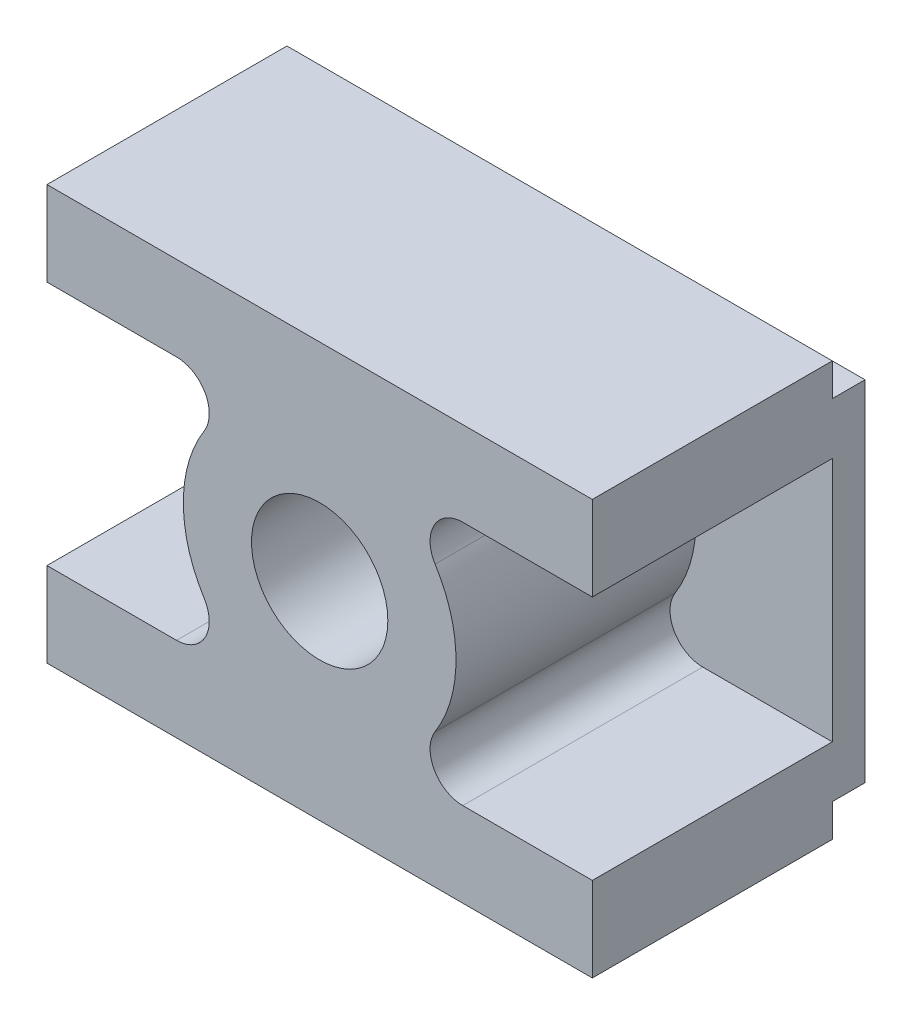
ISO-10303-21;
HEADER;
FILE_DESCRIPTION(('STEP AP214'),'2;1');
FILE_NAME('part.step','',(''),(''),'','','');
FILE_SCHEMA(('AUTOMOTIVE_DESIGN { 1 0 10303 214 1 1 1 1 }'));
ENDSEC;
DATA;
#1=APPLICATION_CONTEXT('core data for automotive mechanical design processes');
#2=APPLICATION_PROTOCOL_DEFINITION('international standard','automotive_design',2000,#1);
#3=PRODUCT_CONTEXT('',#1,'mechanical');
#4=PRODUCT('Part','Part','',(#3));
#5=PRODUCT_RELATED_PRODUCT_CATEGORY('part','',(#4));
#6=PRODUCT_DEFINITION_FORMATION('','',#4);
#7=PRODUCT_DEFINITION_CONTEXT('part definition',#1,'design');
#8=PRODUCT_DEFINITION('design','',#6,#7);
#9=PRODUCT_DEFINITION_SHAPE('','',#8);
#10=(LENGTH_UNIT() NAMED_UNIT(*) SI_UNIT(.MILLI.,.METRE.));
#11=(NAMED_UNIT(*) PLANE_ANGLE_UNIT() SI_UNIT($,.RADIAN.));
#12=(NAMED_UNIT(*) SI_UNIT($,.STERADIAN.) SOLID_ANGLE_UNIT());
#13=UNCERTAINTY_MEASURE_WITH_UNIT(LENGTH_MEASURE(1.E-05),#10,'distance_accuracy_value','');
#14=(GEOMETRIC_REPRESENTATION_CONTEXT(3) GLOBAL_UNCERTAINTY_ASSIGNED_CONTEXT((#13)) GLOBAL_UNIT_ASSIGNED_CONTEXT((#10,
#11,#12)) REPRESENTATION_CONTEXT('',''));
#15=CARTESIAN_POINT('',(0.,0.,0.));
#16=DIRECTION('',(0.,0.,1.));
#17=DIRECTION('',(1.,0.,0.));
#18=AXIS2_PLACEMENT_3D('',#15,#16,#17);
#19=CARTESIAN_POINT('',(26.2440469440214,16.5,50.));
#20=DIRECTION('',(0.,0.,-1.));
#21=DIRECTION('',(-1.,0.,0.));
#22=AXIS2_PLACEMENT_3D('',#19,#20,#21);
#23=CYLINDRICAL_SURFACE('',#22,5.99999999999999);
#24=DIRECTION('',(0.,0.,-1.));
#25=VECTOR('',#24,1.);
#26=CARTESIAN_POINT('',(21.1645539871141,13.3064516129032,50.));
#27=LINE('',#26,#25);
#28=CARTESIAN_POINT('',(21.1645539871141,13.3064516129032,50.));
#29=VERTEX_POINT('',#28);
#30=CARTESIAN_POINT('',(21.1645539871141,13.3064516129032,6.));
#31=VERTEX_POINT('',#30);
#32=EDGE_CURVE('E280',#29,#31,#27,.T.);
#33=ORIENTED_EDGE('',*,*,#32,.T.);
#34=CARTESIAN_POINT('',(26.2440469440214,16.5,6.));
#35=DIRECTION('',(0.,0.,-1.));
#36=DIRECTION('',(-1.,0.,0.));
#37=AXIS2_PLACEMENT_3D('',#34,#35,#36);
#38=CIRCLE('',#37,6.);
#39=CARTESIAN_POINT('',(26.2440469440214,22.5,6.));
#40=VERTEX_POINT('',#39);
#41=EDGE_CURVE('E226',#31,#40,#38,.T.);
#42=ORIENTED_EDGE('',*,*,#41,.T.);
#43=DIRECTION('',(0.,0.,-1.));
#44=VECTOR('',#43,1.);
#45=CARTESIAN_POINT('',(26.2440469440214,22.5,50.));
#46=LINE('',#45,#44);
#47=CARTESIAN_POINT('',(26.2440469440214,22.5,50.));
#48=VERTEX_POINT('',#47);
#49=EDGE_CURVE('E11',#48,#40,#46,.T.);
#50=ORIENTED_EDGE('',*,*,#49,.F.);
#51=CARTESIAN_POINT('',(26.2440469440214,16.5,50.));
#52=DIRECTION('',(0.,0.,1.));
#53=DIRECTION('',(1.,0.,0.));
#54=AXIS2_PLACEMENT_3D('',#51,#52,#53);
#55=CIRCLE('',#54,5.99999999999999);
#56=EDGE_CURVE('E243',#48,#29,#55,.T.);
#57=ORIENTED_EDGE('',*,*,#56,.T.);
#58=EDGE_LOOP('',(#33,#42,#50,#57));
#59=FACE_BOUND('',#58,.T.);
#60=ADVANCED_FACE('F35',(#59),#23,.F.);
#61=CARTESIAN_POINT('',(0.,22.5,50.));
#62=DIRECTION('',(0.,1.,0.));
#63=DIRECTION('',(0.,0.,1.));
#64=AXIS2_PLACEMENT_3D('',#61,#62,#63);
#65=PLANE('',#64);
#66=DIRECTION('',(1.,0.,0.));
#67=VECTOR('',#66,1.);
#68=CARTESIAN_POINT('',(26.2440469440214,22.5,6.));
#69=LINE('',#68,#67);
#70=CARTESIAN_POINT('',(50.,22.5,6.));
#71=VERTEX_POINT('',#70);
#72=EDGE_CURVE('E221',#40,#71,#69,.T.);
#73=ORIENTED_EDGE('',*,*,#72,.T.);
#74=DIRECTION('',(0.,0.,-1.));
#75=VECTOR('',#74,1.);
#76=CARTESIAN_POINT('',(50.,22.5,50.));
#77=LINE('',#76,#75);
#78=CARTESIAN_POINT('',(50.,22.5,50.));
#79=VERTEX_POINT('',#78);
#80=EDGE_CURVE('E42',#79,#71,#77,.T.);
#81=ORIENTED_EDGE('',*,*,#80,.F.);
#82=DIRECTION('',(1.,0.,0.));
#83=VECTOR('',#82,1.);
#84=CARTESIAN_POINT('',(0.,22.5,50.));
#85=LINE('',#84,#83);
#86=EDGE_CURVE('E246',#48,#79,#85,.T.);
#87=ORIENTED_EDGE('',*,*,#86,.F.);
#88=ORIENTED_EDGE('',*,*,#49,.T.);
#89=EDGE_LOOP('',(#73,#81,#87,#88));
#90=FACE_BOUND('',#89,.T.);
#91=ADVANCED_FACE('F357',(#90),#65,.F.);
#92=CARTESIAN_POINT('',(0.,-22.5,50.));
#93=DIRECTION('',(0.,1.,0.));
#94=DIRECTION('',(0.,0.,1.));
#95=AXIS2_PLACEMENT_3D('',#92,#93,#94);
#96=PLANE('',#95);
#97=DIRECTION('',(0.,0.,-1.));
#98=VECTOR('',#97,1.);
#99=CARTESIAN_POINT('',(50.,-22.5,50.));
#100=LINE('',#99,#98);
#101=CARTESIAN_POINT('',(50.,-22.5,50.));
#102=VERTEX_POINT('',#101);
#103=CARTESIAN_POINT('',(50.,-22.5,6.));
#104=VERTEX_POINT('',#103);
#105=EDGE_CURVE('E295',#102,#104,#100,.T.);
#106=ORIENTED_EDGE('',*,*,#105,.T.);
#107=DIRECTION('',(-1.,0.,0.));
#108=VECTOR('',#107,1.);
#109=CARTESIAN_POINT('',(26.2440469440214,-22.5,6.));
#110=LINE('',#109,#108);
#111=CARTESIAN_POINT('',(26.2440469440214,-22.5,6.));
#112=VERTEX_POINT('',#111);
#113=EDGE_CURVE('E222',#104,#112,#110,.T.);
#114=ORIENTED_EDGE('',*,*,#113,.T.);
#115=DIRECTION('',(0.,0.,-1.));
#116=VECTOR('',#115,1.);
#117=CARTESIAN_POINT('',(26.2440469440214,-22.5,50.));
#118=LINE('',#117,#116);
#119=CARTESIAN_POINT('',(26.2440469440214,-22.5,50.));
#120=VERTEX_POINT('',#119);
#121=EDGE_CURVE('E292',#120,#112,#118,.T.);
#122=ORIENTED_EDGE('',*,*,#121,.F.);
#123=DIRECTION('',(1.,0.,0.));
#124=VECTOR('',#123,1.);
#125=CARTESIAN_POINT('',(0.,-22.5,50.));
#126=LINE('',#125,#124);
#127=EDGE_CURVE('E269',#120,#102,#126,.T.);
#128=ORIENTED_EDGE('',*,*,#127,.T.);
#129=EDGE_LOOP('',(#106,#114,#122,#128));
#130=FACE_BOUND('',#129,.T.);
#131=ADVANCED_FACE('F362',(#130),#96,.T.);
#132=CARTESIAN_POINT('',(26.2440469440214,-16.5,50.));
#133=DIRECTION('',(0.,0.,-1.));
#134=DIRECTION('',(-1.,0.,0.));
#135=AXIS2_PLACEMENT_3D('',#132,#133,#134);
#136=CYLINDRICAL_SURFACE('',#135,6.);
#137=ORIENTED_EDGE('',*,*,#121,.T.);
#138=CARTESIAN_POINT('',(26.2440469440214,-16.5,6.));
#139=DIRECTION('',(0.,0.,-1.));
#140=DIRECTION('',(-1.,0.,0.));
#141=AXIS2_PLACEMENT_3D('',#138,#139,#140);
#142=CIRCLE('',#141,6.);
#143=CARTESIAN_POINT('',(21.1645539871141,-13.3064516129032,6.));
#144=VERTEX_POINT('',#143);
#145=EDGE_CURVE('E368',#112,#144,#142,.T.);
#146=ORIENTED_EDGE('',*,*,#145,.T.);
#147=DIRECTION('',(0.,0.,-1.));
#148=VECTOR('',#147,1.);
#149=CARTESIAN_POINT('',(21.1645539871141,-13.3064516129032,50.));
#150=LINE('',#149,#148);
#151=CARTESIAN_POINT('',(21.1645539871141,-13.3064516129032,50.));
#152=VERTEX_POINT('',#151);
#153=EDGE_CURVE('E289',#152,#144,#150,.T.);
#154=ORIENTED_EDGE('',*,*,#153,.F.);
#155=CARTESIAN_POINT('',(26.2440469440214,-16.5,50.));
#156=DIRECTION('',(0.,0.,1.));
#157=DIRECTION('',(1.,0.,0.));
#158=AXIS2_PLACEMENT_3D('',#155,#156,#157);
#159=CIRCLE('',#158,6.);
#160=EDGE_CURVE('E272',#152,#120,#159,.T.);
#161=ORIENTED_EDGE('',*,*,#160,.T.);
#162=EDGE_LOOP('',(#137,#146,#154,#161));
#163=FACE_BOUND('',#162,.T.);
#164=ADVANCED_FACE('F414',(#163),#136,.F.);
#165=CARTESIAN_POINT('',(0.,0.,50.));
#166=DIRECTION('',(0.,0.,-1.));
#167=DIRECTION('',(-1.,0.,0.));
#168=AXIS2_PLACEMENT_3D('',#165,#166,#167);
#169=CYLINDRICAL_SURFACE('',#168,25.);
#170=CARTESIAN_POINT('',(0.,0.,6.));
#171=DIRECTION('',(0.,0.,1.));
#172=DIRECTION('',(-1.,0.,0.));
#173=AXIS2_PLACEMENT_3D('',#170,#171,#172);
#174=CIRCLE('',#173,25.);
#175=EDGE_CURVE('E367',#144,#31,#174,.T.);
#176=ORIENTED_EDGE('',*,*,#175,.T.);
#177=ORIENTED_EDGE('',*,*,#32,.F.);
#178=CARTESIAN_POINT('',(0.,0.,50.));
#179=DIRECTION('',(0.,0.,1.));
#180=DIRECTION('',(1.,0.,0.));
#181=AXIS2_PLACEMENT_3D('',#178,#179,#180);
#182=CIRCLE('',#181,25.);
#183=EDGE_CURVE('E275',#152,#29,#182,.T.);
#184=ORIENTED_EDGE('',*,*,#183,.F.);
#185=ORIENTED_EDGE('',*,*,#153,.T.);
#186=EDGE_LOOP('',(#176,#177,#184,#185));
#187=FACE_BOUND('',#186,.T.);
#188=ADVANCED_FACE('F415',(#187),#169,.T.);
#189=CARTESIAN_POINT('',(0.,22.5,50.));
#190=DIRECTION('',(0.,1.,0.));
#191=DIRECTION('',(0.,0.,1.));
#192=AXIS2_PLACEMENT_3D('',#189,#190,#191);
#193=PLANE('',#192);
#194=DIRECTION('',(1.,0.,0.));
#195=VECTOR('',#194,1.);
#196=CARTESIAN_POINT('',(-50.,22.5,6.));
#197=LINE('',#196,#195);
#198=CARTESIAN_POINT('',(-50.,22.5,6.));
#199=VERTEX_POINT('',#198);
#200=CARTESIAN_POINT('',(-26.2440469440214,22.5,6.));
#201=VERTEX_POINT('',#200);
#202=EDGE_CURVE('E232',#199,#201,#197,.T.);
#203=ORIENTED_EDGE('',*,*,#202,.T.);
#204=DIRECTION('',(0.,0.,-1.));
#205=VECTOR('',#204,1.);
#206=CARTESIAN_POINT('',(-26.2440469440214,22.5,50.));
#207=LINE('',#206,#205);
#208=CARTESIAN_POINT('',(-26.2440469440214,22.5,50.));
#209=VERTEX_POINT('',#208);
#210=EDGE_CURVE('E199',#209,#201,#207,.T.);
#211=ORIENTED_EDGE('',*,*,#210,.F.);
#212=DIRECTION('',(1.,0.,0.));
#213=VECTOR('',#212,1.);
#214=CARTESIAN_POINT('',(0.,22.5,50.));
#215=LINE('',#214,#213);
#216=CARTESIAN_POINT('',(-50.,22.5,50.));
#217=VERTEX_POINT('',#216);
#218=EDGE_CURVE('E254',#217,#209,#215,.T.);
#219=ORIENTED_EDGE('',*,*,#218,.F.);
#220=DIRECTION('',(0.,0.,-1.));
#221=VECTOR('',#220,1.);
#222=CARTESIAN_POINT('',(-50.,22.5,50.));
#223=LINE('',#222,#221);
#224=EDGE_CURVE('E196',#217,#199,#223,.T.);
#225=ORIENTED_EDGE('',*,*,#224,.T.);
#226=EDGE_LOOP('',(#203,#211,#219,#225));
#227=FACE_BOUND('',#226,.T.);
#228=ADVANCED_FACE('F344',(#227),#193,.F.);
#229=CARTESIAN_POINT('',(-26.2440469440214,16.5,50.));
#230=DIRECTION('',(0.,0.,-1.));
#231=DIRECTION('',(-1.,0.,0.));
#232=AXIS2_PLACEMENT_3D('',#229,#230,#231);
#233=CYLINDRICAL_SURFACE('',#232,5.99999999999999);
#234=ORIENTED_EDGE('',*,*,#210,.T.);
#235=CARTESIAN_POINT('',(-26.2440469440214,16.5,6.));
#236=DIRECTION('',(0.,0.,-1.));
#237=DIRECTION('',(-1.,0.,0.));
#238=AXIS2_PLACEMENT_3D('',#235,#236,#237);
#239=CIRCLE('',#238,6.);
#240=CARTESIAN_POINT('',(-21.164553987114,13.3064516129032,6.));
#241=VERTEX_POINT('',#240);
#242=EDGE_CURVE('E234',#201,#241,#239,.T.);
#243=ORIENTED_EDGE('',*,*,#242,.T.);
#244=DIRECTION('',(0.,0.,-1.));
#245=VECTOR('',#244,1.);
#246=CARTESIAN_POINT('',(-21.164553987114,13.3064516129032,50.));
#247=LINE('',#246,#245);
#248=CARTESIAN_POINT('',(-21.164553987114,13.3064516129032,50.));
#249=VERTEX_POINT('',#248);
#250=EDGE_CURVE('E312',#249,#241,#247,.T.);
#251=ORIENTED_EDGE('',*,*,#250,.F.);
#252=CARTESIAN_POINT('',(-26.2440469440214,16.5,50.));
#253=DIRECTION('',(0.,0.,1.));
#254=DIRECTION('',(1.,0.,0.));
#255=AXIS2_PLACEMENT_3D('',#252,#253,#254);
#256=CIRCLE('',#255,5.99999999999999);
#257=EDGE_CURVE('E257',#249,#209,#256,.T.);
#258=ORIENTED_EDGE('',*,*,#257,.T.);
#259=EDGE_LOOP('',(#234,#243,#251,#258));
#260=FACE_BOUND('',#259,.T.);
#261=ADVANCED_FACE('F318',(#260),#233,.F.);
#262=CARTESIAN_POINT('',(0.,0.,50.));
#263=DIRECTION('',(0.,0.,-1.));
#264=DIRECTION('',(-1.,0.,0.));
#265=AXIS2_PLACEMENT_3D('',#262,#263,#264);
#266=CYLINDRICAL_SURFACE('',#265,25.);
#267=CARTESIAN_POINT('',(0.,0.,6.));
#268=DIRECTION('',(0.,0.,1.));
#269=DIRECTION('',(-1.,0.,0.));
#270=AXIS2_PLACEMENT_3D('',#267,#268,#269);
#271=CIRCLE('',#270,25.);
#272=CARTESIAN_POINT('',(-21.164553987114,-13.3064516129032,6.));
#273=VERTEX_POINT('',#272);
#274=EDGE_CURVE('E236',#241,#273,#271,.T.);
#275=ORIENTED_EDGE('',*,*,#274,.T.);
#276=DIRECTION('',(0.,0.,-1.));
#277=VECTOR('',#276,1.);
#278=CARTESIAN_POINT('',(-21.164553987114,-13.3064516129032,50.));
#279=LINE('',#278,#277);
#280=CARTESIAN_POINT('',(-21.164553987114,-13.3064516129032,50.));
#281=VERTEX_POINT('',#280);
#282=EDGE_CURVE('E309',#281,#273,#279,.T.);
#283=ORIENTED_EDGE('',*,*,#282,.F.);
#284=CARTESIAN_POINT('',(0.,0.,50.));
#285=DIRECTION('',(0.,0.,1.));
#286=DIRECTION('',(1.,0.,0.));
#287=AXIS2_PLACEMENT_3D('',#284,#285,#286);
#288=CIRCLE('',#287,25.);
#289=EDGE_CURVE('E260',#249,#281,#288,.T.);
#290=ORIENTED_EDGE('',*,*,#289,.F.);
#291=ORIENTED_EDGE('',*,*,#250,.T.);
#292=EDGE_LOOP('',(#275,#283,#290,#291));
#293=FACE_BOUND('',#292,.T.);
#294=ADVANCED_FACE('F331',(#293),#266,.T.);
#295=CARTESIAN_POINT('',(-26.2440469440214,-16.5,50.));
#296=DIRECTION('',(0.,0.,-1.));
#297=DIRECTION('',(-1.,0.,0.));
#298=AXIS2_PLACEMENT_3D('',#295,#296,#297);
#299=CYLINDRICAL_SURFACE('',#298,6.);
#300=CARTESIAN_POINT('',(-26.2440469440214,-16.5,6.));
#301=DIRECTION('',(0.,0.,-1.));
#302=DIRECTION('',(-1.,0.,0.));
#303=AXIS2_PLACEMENT_3D('',#300,#301,#302);
#304=CIRCLE('',#303,6.);
#305=CARTESIAN_POINT('',(-26.2440469440214,-22.5,6.));
#306=VERTEX_POINT('',#305);
#307=EDGE_CURVE('E238',#273,#306,#304,.T.);
#308=ORIENTED_EDGE('',*,*,#307,.T.);
#309=DIRECTION('',(0.,0.,-1.));
#310=VECTOR('',#309,1.);
#311=CARTESIAN_POINT('',(-26.2440469440214,-22.5,50.));
#312=LINE('',#311,#310);
#313=CARTESIAN_POINT('',(-26.2440469440214,-22.5,50.));
#314=VERTEX_POINT('',#313);
#315=EDGE_CURVE('E306',#314,#306,#312,.T.);
#316=ORIENTED_EDGE('',*,*,#315,.F.);
#317=CARTESIAN_POINT('',(-26.2440469440214,-16.5,50.));
#318=DIRECTION('',(0.,0.,1.));
#319=DIRECTION('',(1.,0.,0.));
#320=AXIS2_PLACEMENT_3D('',#317,#318,#319);
#321=CIRCLE('',#320,6.);
#322=EDGE_CURVE('E262',#281,#314,#321,.F.);
#323=ORIENTED_EDGE('',*,*,#322,.F.);
#324=ORIENTED_EDGE('',*,*,#282,.T.);
#325=EDGE_LOOP('',(#308,#316,#323,#324));
#326=FACE_BOUND('',#325,.T.);
#327=ADVANCED_FACE('F335',(#326),#299,.F.);
#328=CARTESIAN_POINT('',(0.,-22.5,50.));
#329=DIRECTION('',(0.,1.,0.));
#330=DIRECTION('',(0.,0.,1.));
#331=AXIS2_PLACEMENT_3D('',#328,#329,#330);
#332=PLANE('',#331);
#333=ORIENTED_EDGE('',*,*,#315,.T.);
#334=DIRECTION('',(-1.,0.,0.));
#335=VECTOR('',#334,1.);
#336=CARTESIAN_POINT('',(-50.,-22.5,6.));
#337=LINE('',#336,#335);
#338=CARTESIAN_POINT('',(-50.,-22.5,6.));
#339=VERTEX_POINT('',#338);
#340=EDGE_CURVE('E240',#306,#339,#337,.T.);
#341=ORIENTED_EDGE('',*,*,#340,.T.);
#342=DIRECTION('',(0.,0.,-1.));
#343=VECTOR('',#342,1.);
#344=CARTESIAN_POINT('',(-50.,-22.5,50.));
#345=LINE('',#344,#343);
#346=CARTESIAN_POINT('',(-50.,-22.5,50.));
#347=VERTEX_POINT('',#346);
#348=EDGE_CURVE('E303',#347,#339,#345,.T.);
#349=ORIENTED_EDGE('',*,*,#348,.F.);
#350=DIRECTION('',(1.,0.,0.));
#351=VECTOR('',#350,1.);
#352=CARTESIAN_POINT('',(0.,-22.5,50.));
#353=LINE('',#352,#351);
#354=EDGE_CURVE('E264',#347,#314,#353,.T.);
#355=ORIENTED_EDGE('',*,*,#354,.T.);
#356=EDGE_LOOP('',(#333,#341,#349,#355));
#357=FACE_BOUND('',#356,.T.);
#358=ADVANCED_FACE('F346',(#357),#332,.T.);
#359=CARTESIAN_POINT('',(0.,38.,50.));
#360=DIRECTION('',(0.,1.,0.));
#361=DIRECTION('',(0.,0.,1.));
#362=AXIS2_PLACEMENT_3D('',#359,#360,#361);
#363=PLANE('',#362);
#364=DIRECTION('',(1.,0.,0.));
#365=VECTOR('',#364,1.);
#366=CARTESIAN_POINT('',(-50.,38.,6.));
#367=LINE('',#366,#365);
#368=CARTESIAN_POINT('',(-50.,38.,6.));
#369=VERTEX_POINT('',#368);
#370=CARTESIAN_POINT('',(50.,38.,6.));
#371=VERTEX_POINT('',#370);
#372=EDGE_CURVE('E174',#369,#371,#367,.T.);
#373=ORIENTED_EDGE('',*,*,#372,.F.);
#374=DIRECTION('',(0.,0.,-1.));
#375=VECTOR('',#374,1.);
#376=CARTESIAN_POINT('',(-50.,38.,50.));
#377=LINE('',#376,#375);
#378=CARTESIAN_POINT('',(-50.,38.,50.));
#379=VERTEX_POINT('',#378);
#380=EDGE_CURVE('E187',#379,#369,#377,.T.);
#381=ORIENTED_EDGE('',*,*,#380,.F.);
#382=DIRECTION('',(1.,0.,0.));
#383=VECTOR('',#382,1.);
#384=CARTESIAN_POINT('',(0.,38.,50.));
#385=LINE('',#384,#383);
#386=CARTESIAN_POINT('',(50.,38.,50.));
#387=VERTEX_POINT('',#386);
#388=EDGE_CURVE('E250',#379,#387,#385,.T.);
#389=ORIENTED_EDGE('',*,*,#388,.T.);
#390=DIRECTION('',(0.,0.,-1.));
#391=VECTOR('',#390,1.);
#392=CARTESIAN_POINT('',(50.,38.,50.));
#393=LINE('',#392,#391);
#394=EDGE_CURVE('E190',#387,#371,#393,.T.);
#395=ORIENTED_EDGE('',*,*,#394,.T.);
#396=EDGE_LOOP('',(#373,#381,#389,#395));
#397=FACE_BOUND('',#396,.T.);
#398=ADVANCED_FACE('F185',(#397),#363,.T.);
#399=CARTESIAN_POINT('',(-50.,0.,50.));
#400=DIRECTION('',(-1.,0.,0.));
#401=DIRECTION('',(0.,0.,1.));
#402=AXIS2_PLACEMENT_3D('',#399,#400,#401);
#403=PLANE('',#402);
#404=DIRECTION('',(0.,0.,-1.));
#405=VECTOR('',#404,1.);
#406=CARTESIAN_POINT('',(-50.,32.,0.));
#407=LINE('',#406,#405);
#408=CARTESIAN_POINT('',(-50.,32.,6.));
#409=VERTEX_POINT('',#408);
#410=CARTESIAN_POINT('',(-50.,32.,0.));
#411=VERTEX_POINT('',#410);
#412=EDGE_CURVE('E181',#409,#411,#407,.T.);
#413=ORIENTED_EDGE('',*,*,#412,.T.);
#414=DIRECTION('',(0.,1.,0.));
#415=VECTOR('',#414,1.);
#416=CARTESIAN_POINT('',(-50.,0.,0.));
#417=LINE('',#416,#415);
#418=CARTESIAN_POINT('',(-50.,-32.,0.));
#419=VERTEX_POINT('',#418);
#420=EDGE_CURVE('E242',#419,#411,#417,.T.);
#421=ORIENTED_EDGE('',*,*,#420,.F.);
#422=DIRECTION('',(0.,0.,1.));
#423=VECTOR('',#422,1.);
#424=CARTESIAN_POINT('',(-50.,-32.,0.));
#425=LINE('',#424,#423);
#426=CARTESIAN_POINT('',(-50.,-32.,6.));
#427=VERTEX_POINT('',#426);
#428=EDGE_CURVE('E49',#419,#427,#425,.T.);
#429=ORIENTED_EDGE('',*,*,#428,.T.);
#430=DIRECTION('',(0.,-1.,0.));
#431=VECTOR('',#430,1.);
#432=CARTESIAN_POINT('',(-50.,-38.,6.));
#433=LINE('',#432,#431);
#434=CARTESIAN_POINT('',(-50.,-38.,6.));
#435=VERTEX_POINT('',#434);
#436=EDGE_CURVE('E376',#427,#435,#433,.T.);
#437=ORIENTED_EDGE('',*,*,#436,.T.);
#438=DIRECTION('',(0.,0.,-1.));
#439=VECTOR('',#438,1.);
#440=CARTESIAN_POINT('',(-50.,-38.,50.));
#441=LINE('',#440,#439);
#442=CARTESIAN_POINT('',(-50.,-38.,50.));
#443=VERTEX_POINT('',#442);
#444=EDGE_CURVE('E300',#443,#435,#441,.T.);
#445=ORIENTED_EDGE('',*,*,#444,.F.);
#446=DIRECTION('',(0.,1.,0.));
#447=VECTOR('',#446,1.);
#448=CARTESIAN_POINT('',(-50.,0.,50.));
#449=LINE('',#448,#447);
#450=EDGE_CURVE('E255',#443,#347,#449,.T.);
#451=ORIENTED_EDGE('',*,*,#450,.T.);
#452=ORIENTED_EDGE('',*,*,#348,.T.);
#453=DIRECTION('',(0.,1.,0.));
#454=VECTOR('',#453,1.);
#455=CARTESIAN_POINT('',(-50.,22.5,6.));
#456=LINE('',#455,#454);
#457=EDGE_CURVE('E224',#339,#199,#456,.T.);
#458=ORIENTED_EDGE('',*,*,#457,.T.);
#459=ORIENTED_EDGE('',*,*,#224,.F.);
#460=EDGE_CURVE('E195',#217,#379,#449,.T.);
#461=ORIENTED_EDGE('',*,*,#460,.T.);
#462=ORIENTED_EDGE('',*,*,#380,.T.);
#463=DIRECTION('',(0.,-1.,0.));
#464=VECTOR('',#463,1.);
#465=CARTESIAN_POINT('',(-50.,38.,6.));
#466=LINE('',#465,#464);
#467=EDGE_CURVE('E170',#369,#409,#466,.T.);
#468=ORIENTED_EDGE('',*,*,#467,.T.);
#469=EDGE_LOOP('',(#413,#421,#429,#437,#445,#451,#452,#458,#459,#461,#462,#468));
#470=FACE_BOUND('',#469,.T.);
#471=ADVANCED_FACE('F193',(#470),#403,.T.);
#472=CARTESIAN_POINT('',(0.,-38.,50.));
#473=DIRECTION('',(0.,1.,0.));
#474=DIRECTION('',(0.,0.,1.));
#475=AXIS2_PLACEMENT_3D('',#472,#473,#474);
#476=PLANE('',#475);
#477=ORIENTED_EDGE('',*,*,#444,.T.);
#478=DIRECTION('',(1.,0.,0.));
#479=VECTOR('',#478,1.);
#480=CARTESIAN_POINT('',(-50.,-38.,6.));
#481=LINE('',#480,#479);
#482=CARTESIAN_POINT('',(50.,-38.,6.));
#483=VERTEX_POINT('',#482);
#484=EDGE_CURVE('E378',#435,#483,#481,.T.);
#485=ORIENTED_EDGE('',*,*,#484,.T.);
#486=DIRECTION('',(0.,0.,-1.));
#487=VECTOR('',#486,1.);
#488=CARTESIAN_POINT('',(50.,-38.,50.));
#489=LINE('',#488,#487);
#490=CARTESIAN_POINT('',(50.,-38.,50.));
#491=VERTEX_POINT('',#490);
#492=EDGE_CURVE('E297',#491,#483,#489,.T.);
#493=ORIENTED_EDGE('',*,*,#492,.F.);
#494=DIRECTION('',(1.,0.,0.));
#495=VECTOR('',#494,1.);
#496=CARTESIAN_POINT('',(0.,-38.,50.));
#497=LINE('',#496,#495);
#498=EDGE_CURVE('E267',#443,#491,#497,.T.);
#499=ORIENTED_EDGE('',*,*,#498,.F.);
#500=EDGE_LOOP('',(#477,#485,#493,#499));
#501=FACE_BOUND('',#500,.T.);
#502=ADVANCED_FACE('F408',(#501),#476,.F.);
#503=CARTESIAN_POINT('',(50.,0.,50.));
#504=DIRECTION('',(-1.,0.,0.));
#505=DIRECTION('',(0.,0.,1.));
#506=AXIS2_PLACEMENT_3D('',#503,#504,#505);
#507=PLANE('',#506);
#508=DIRECTION('',(0.,1.,0.));
#509=VECTOR('',#508,1.);
#510=CARTESIAN_POINT('',(50.,0.,0.));
#511=LINE('',#510,#509);
#512=CARTESIAN_POINT('',(50.,-32.,0.));
#513=VERTEX_POINT('',#512);
#514=CARTESIAN_POINT('',(50.,32.,0.));
#515=VERTEX_POINT('',#514);
#516=EDGE_CURVE('E281',#513,#515,#511,.T.);
#517=ORIENTED_EDGE('',*,*,#516,.T.);
#518=DIRECTION('',(0.,0.,-1.));
#519=VECTOR('',#518,1.);
#520=CARTESIAN_POINT('',(50.,32.,0.));
#521=LINE('',#520,#519);
#522=CARTESIAN_POINT('',(50.,32.,6.));
#523=VERTEX_POINT('',#522);
#524=EDGE_CURVE('E57',#523,#515,#521,.T.);
#525=ORIENTED_EDGE('',*,*,#524,.F.);
#526=DIRECTION('',(0.,-1.,0.));
#527=VECTOR('',#526,1.);
#528=CARTESIAN_POINT('',(50.,38.,6.));
#529=LINE('',#528,#527);
#530=EDGE_CURVE('E381',#371,#523,#529,.T.);
#531=ORIENTED_EDGE('',*,*,#530,.F.);
#532=ORIENTED_EDGE('',*,*,#394,.F.);
#533=DIRECTION('',(0.,1.,0.));
#534=VECTOR('',#533,1.);
#535=CARTESIAN_POINT('',(50.,0.,50.));
#536=LINE('',#535,#534);
#537=EDGE_CURVE('E213',#79,#387,#536,.T.);
#538=ORIENTED_EDGE('',*,*,#537,.F.);
#539=ORIENTED_EDGE('',*,*,#80,.T.);
#540=DIRECTION('',(0.,-1.,0.));
#541=VECTOR('',#540,1.);
#542=CARTESIAN_POINT('',(50.,22.5,6.));
#543=LINE('',#542,#541);
#544=EDGE_CURVE('E211',#71,#104,#543,.T.);
#545=ORIENTED_EDGE('',*,*,#544,.T.);
#546=ORIENTED_EDGE('',*,*,#105,.F.);
#547=EDGE_CURVE('E251',#491,#102,#536,.T.);
#548=ORIENTED_EDGE('',*,*,#547,.F.);
#549=ORIENTED_EDGE('',*,*,#492,.T.);
#550=DIRECTION('',(0.,-1.,0.));
#551=VECTOR('',#550,1.);
#552=CARTESIAN_POINT('',(50.,-38.,6.));
#553=LINE('',#552,#551);
#554=CARTESIAN_POINT('',(50.,-32.,6.));
#555=VERTEX_POINT('',#554);
#556=EDGE_CURVE('E382',#555,#483,#553,.T.);
#557=ORIENTED_EDGE('',*,*,#556,.F.);
#558=DIRECTION('',(0.,0.,1.));
#559=VECTOR('',#558,1.);
#560=CARTESIAN_POINT('',(50.,-32.,0.));
#561=LINE('',#560,#559);
#562=EDGE_CURVE('E384',#513,#555,#561,.T.);
#563=ORIENTED_EDGE('',*,*,#562,.F.);
#564=EDGE_LOOP('',(#517,#525,#531,#532,#538,#539,#545,#546,#548,#549,#557,#563));
#565=FACE_BOUND('',#564,.T.);
#566=ADVANCED_FACE('F209',(#565),#507,.F.);
#567=CARTESIAN_POINT('',(0.,0.,50.));
#568=DIRECTION('',(0.,0.,-1.));
#569=DIRECTION('',(-1.,0.,0.));
#570=AXIS2_PLACEMENT_3D('',#567,#568,#569);
#571=CYLINDRICAL_SURFACE('',#570,12.5);
#572=CARTESIAN_POINT('',(0.,0.,50.));
#573=DIRECTION('',(0.,0.,1.));
#574=DIRECTION('',(1.,0.,0.));
#575=AXIS2_PLACEMENT_3D('',#572,#573,#574);
#576=CIRCLE('',#575,12.5);
#577=CARTESIAN_POINT('',(12.5,0.,50.));
#578=VERTEX_POINT('',#577);
#579=EDGE_CURVE('E277',#578,#578,#576,.T.);
#580=ORIENTED_EDGE('',*,*,#579,.T.);
#581=EDGE_LOOP('',(#580));
#582=FACE_BOUND('',#581,.T.);
#583=CARTESIAN_POINT('',(0.,0.,0.));
#584=DIRECTION('',(0.,0.,1.));
#585=DIRECTION('',(1.,0.,0.));
#586=AXIS2_PLACEMENT_3D('',#583,#584,#585);
#587=CIRCLE('',#586,12.5);
#588=CARTESIAN_POINT('',(12.5,0.,0.));
#589=VERTEX_POINT('',#588);
#590=EDGE_CURVE('E247',#589,#589,#587,.T.);
#591=ORIENTED_EDGE('',*,*,#590,.F.);
#592=EDGE_LOOP('',(#591));
#593=FACE_BOUND('',#592,.T.);
#594=ADVANCED_FACE('F425',(#582,#593),#571,.F.);
#595=CARTESIAN_POINT('',(0.,0.,50.));
#596=DIRECTION('',(0.,0.,1.));
#597=DIRECTION('',(1.,0.,0.));
#598=AXIS2_PLACEMENT_3D('',#595,#596,#597);
#599=PLANE('',#598);
#600=ORIENTED_EDGE('',*,*,#56,.F.);
#601=ORIENTED_EDGE('',*,*,#86,.T.);
#602=ORIENTED_EDGE('',*,*,#537,.T.);
#603=ORIENTED_EDGE('',*,*,#388,.F.);
#604=ORIENTED_EDGE('',*,*,#460,.F.);
#605=ORIENTED_EDGE('',*,*,#218,.T.);
#606=ORIENTED_EDGE('',*,*,#257,.F.);
#607=ORIENTED_EDGE('',*,*,#289,.T.);
#608=ORIENTED_EDGE('',*,*,#322,.T.);
#609=ORIENTED_EDGE('',*,*,#354,.F.);
#610=ORIENTED_EDGE('',*,*,#450,.F.);
#611=ORIENTED_EDGE('',*,*,#498,.T.);
#612=ORIENTED_EDGE('',*,*,#547,.T.);
#613=ORIENTED_EDGE('',*,*,#127,.F.);
#614=ORIENTED_EDGE('',*,*,#160,.F.);
#615=ORIENTED_EDGE('',*,*,#183,.T.);
#616=EDGE_LOOP('',(#600,#601,#602,#603,#604,#605,#606,#607,#608,#609,#610,#611,#612,#613,#614,#615));
#617=FACE_BOUND('',#616,.T.);
#618=ORIENTED_EDGE('',*,*,#579,.F.);
#619=EDGE_LOOP('',(#618));
#620=FACE_BOUND('',#619,.T.);
#621=ADVANCED_FACE('F340',(#617,#620),#599,.T.);
#622=CARTESIAN_POINT('',(0.,0.,0.));
#623=DIRECTION('',(0.,0.,1.));
#624=DIRECTION('',(1.,0.,0.));
#625=AXIS2_PLACEMENT_3D('',#622,#623,#624);
#626=PLANE('',#625);
#627=ORIENTED_EDGE('',*,*,#420,.T.);
#628=DIRECTION('',(1.,0.,0.));
#629=VECTOR('',#628,1.);
#630=CARTESIAN_POINT('',(-50.,32.,0.));
#631=LINE('',#630,#629);
#632=EDGE_CURVE('E372',#411,#515,#631,.T.);
#633=ORIENTED_EDGE('',*,*,#632,.T.);
#634=ORIENTED_EDGE('',*,*,#516,.F.);
#635=DIRECTION('',(1.,0.,0.));
#636=VECTOR('',#635,1.);
#637=CARTESIAN_POINT('',(-50.,-32.,0.));
#638=LINE('',#637,#636);
#639=EDGE_CURVE('E373',#419,#513,#638,.T.);
#640=ORIENTED_EDGE('',*,*,#639,.F.);
#641=EDGE_LOOP('',(#627,#633,#634,#640));
#642=FACE_BOUND('',#641,.T.);
#643=ORIENTED_EDGE('',*,*,#590,.T.);
#644=EDGE_LOOP('',(#643));
#645=FACE_BOUND('',#644,.T.);
#646=ADVANCED_FACE('F396',(#642,#645),#626,.F.);
#647=CARTESIAN_POINT('',(-26.2440469440214,-16.5,6.));
#648=DIRECTION('',(0.,0.,-1.));
#649=DIRECTION('',(-1.,0.,0.));
#650=AXIS2_PLACEMENT_3D('',#647,#648,#649);
#651=PLANE('',#650);
#652=ORIENTED_EDGE('',*,*,#457,.F.);
#653=ORIENTED_EDGE('',*,*,#340,.F.);
#654=ORIENTED_EDGE('',*,*,#307,.F.);
#655=ORIENTED_EDGE('',*,*,#274,.F.);
#656=ORIENTED_EDGE('',*,*,#242,.F.);
#657=ORIENTED_EDGE('',*,*,#202,.F.);
#658=EDGE_LOOP('',(#652,#653,#654,#655,#656,#657));
#659=FACE_BOUND('',#658,.T.);
#660=ADVANCED_FACE('F326',(#659),#651,.F.);
#661=CARTESIAN_POINT('',(26.2440469440214,-16.5,6.));
#662=DIRECTION('',(0.,0.,-1.));
#663=DIRECTION('',(-1.,0.,0.));
#664=AXIS2_PLACEMENT_3D('',#661,#662,#663);
#665=PLANE('',#664);
#666=ORIENTED_EDGE('',*,*,#145,.F.);
#667=ORIENTED_EDGE('',*,*,#113,.F.);
#668=ORIENTED_EDGE('',*,*,#544,.F.);
#669=ORIENTED_EDGE('',*,*,#72,.F.);
#670=ORIENTED_EDGE('',*,*,#41,.F.);
#671=ORIENTED_EDGE('',*,*,#175,.F.);
#672=EDGE_LOOP('',(#666,#667,#668,#669,#670,#671));
#673=FACE_BOUND('',#672,.T.);
#674=ADVANCED_FACE('F219',(#673),#665,.F.);
#675=CARTESIAN_POINT('',(-50.,-38.,6.));
#676=DIRECTION('',(0.,0.,1.));
#677=DIRECTION('',(1.,0.,0.));
#678=AXIS2_PLACEMENT_3D('',#675,#676,#677);
#679=PLANE('',#678);
#680=ORIENTED_EDGE('',*,*,#556,.T.);
#681=ORIENTED_EDGE('',*,*,#484,.F.);
#682=ORIENTED_EDGE('',*,*,#436,.F.);
#683=DIRECTION('',(1.,0.,0.));
#684=VECTOR('',#683,1.);
#685=CARTESIAN_POINT('',(-50.,-32.,6.));
#686=LINE('',#685,#684);
#687=EDGE_CURVE('E375',#427,#555,#686,.T.);
#688=ORIENTED_EDGE('',*,*,#687,.T.);
#689=EDGE_LOOP('',(#680,#681,#682,#688));
#690=FACE_BOUND('',#689,.T.);
#691=ADVANCED_FACE('F405',(#690),#679,.F.);
#692=CARTESIAN_POINT('',(-50.,-32.,0.));
#693=DIRECTION('',(0.,1.,0.));
#694=DIRECTION('',(0.,0.,1.));
#695=AXIS2_PLACEMENT_3D('',#692,#693,#694);
#696=PLANE('',#695);
#697=ORIENTED_EDGE('',*,*,#562,.T.);
#698=ORIENTED_EDGE('',*,*,#687,.F.);
#699=ORIENTED_EDGE('',*,*,#428,.F.);
#700=ORIENTED_EDGE('',*,*,#639,.T.);
#701=EDGE_LOOP('',(#697,#698,#699,#700));
#702=FACE_BOUND('',#701,.T.);
#703=ADVANCED_FACE('F400',(#702),#696,.F.);
#704=CARTESIAN_POINT('',(-50.,32.,0.));
#705=DIRECTION('',(0.,-1.,0.));
#706=DIRECTION('',(0.,0.,-1.));
#707=AXIS2_PLACEMENT_3D('',#704,#705,#706);
#708=PLANE('',#707);
#709=ORIENTED_EDGE('',*,*,#524,.T.);
#710=ORIENTED_EDGE('',*,*,#632,.F.);
#711=ORIENTED_EDGE('',*,*,#412,.F.);
#712=DIRECTION('',(1.,0.,0.));
#713=VECTOR('',#712,1.);
#714=CARTESIAN_POINT('',(-50.,32.,6.));
#715=LINE('',#714,#713);
#716=EDGE_CURVE('E176',#409,#523,#715,.T.);
#717=ORIENTED_EDGE('',*,*,#716,.T.);
#718=EDGE_LOOP('',(#709,#710,#711,#717));
#719=FACE_BOUND('',#718,.T.);
#720=ADVANCED_FACE('F487',(#719),#708,.F.);
#721=CARTESIAN_POINT('',(-50.,38.,6.));
#722=DIRECTION('',(0.,0.,1.));
#723=DIRECTION('',(0.,-1.,0.));
#724=AXIS2_PLACEMENT_3D('',#721,#722,#723);
#725=PLANE('',#724);
#726=ORIENTED_EDGE('',*,*,#530,.T.);
#727=ORIENTED_EDGE('',*,*,#716,.F.);
#728=ORIENTED_EDGE('',*,*,#467,.F.);
#729=ORIENTED_EDGE('',*,*,#372,.T.);
#730=EDGE_LOOP('',(#726,#727,#728,#729));
#731=FACE_BOUND('',#730,.T.);
#732=ADVANCED_FACE('F173',(#731),#725,.F.);
#733=CLOSED_SHELL('',(#60,#91,#131,#164,#188,#228,#261,#294,#327,#358,#398,#471,#502,#566,#594,
#621,#646,#660,#674,#691,#703,#720,#732));
#734=MANIFOLD_SOLID_BREP('B2',#733);
#735=ADVANCED_BREP_SHAPE_REPRESENTATION('',(#18,#734),#14);
#736=SHAPE_DEFINITION_REPRESENTATION(#9,#735);
ENDSEC;
END-ISO-10303-21;
